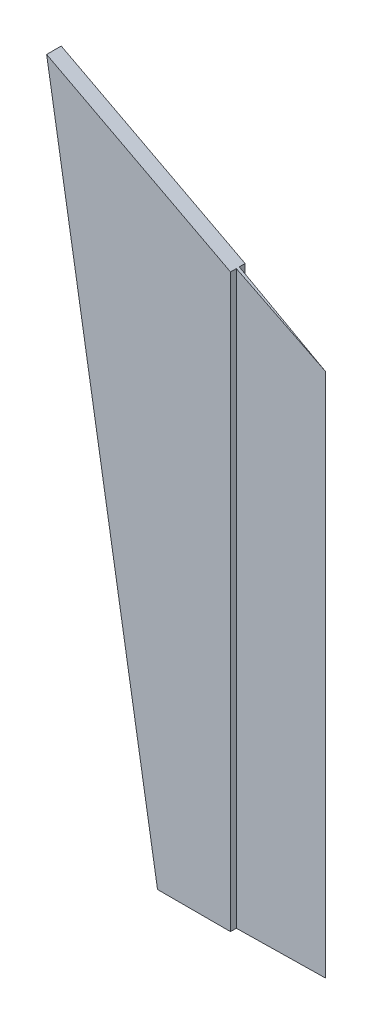
ISO-10303-21;
HEADER;
FILE_DESCRIPTION(('STEP AP214'),'2;1');
FILE_NAME('part.step','',(''),(''),'','','');
FILE_SCHEMA(('AUTOMOTIVE_DESIGN { 1 0 10303 214 1 1 1 1 }'));
ENDSEC;
DATA;
#1=APPLICATION_CONTEXT('core data for automotive mechanical design processes');
#2=APPLICATION_PROTOCOL_DEFINITION('international standard','automotive_design',2000,#1);
#3=PRODUCT_CONTEXT('',#1,'mechanical');
#4=PRODUCT('Part','Part','',(#3));
#5=PRODUCT_RELATED_PRODUCT_CATEGORY('part','',(#4));
#6=PRODUCT_DEFINITION_FORMATION('','',#4);
#7=PRODUCT_DEFINITION_CONTEXT('part definition',#1,'design');
#8=PRODUCT_DEFINITION('design','',#6,#7);
#9=PRODUCT_DEFINITION_SHAPE('','',#8);
#10=(LENGTH_UNIT() NAMED_UNIT(*) SI_UNIT(.MILLI.,.METRE.));
#11=(NAMED_UNIT(*) PLANE_ANGLE_UNIT() SI_UNIT($,.RADIAN.));
#12=(NAMED_UNIT(*) SI_UNIT($,.STERADIAN.) SOLID_ANGLE_UNIT());
#13=UNCERTAINTY_MEASURE_WITH_UNIT(LENGTH_MEASURE(1.E-05),#10,'distance_accuracy_value','');
#14=(GEOMETRIC_REPRESENTATION_CONTEXT(3) GLOBAL_UNCERTAINTY_ASSIGNED_CONTEXT((#13)) GLOBAL_UNIT_ASSIGNED_CONTEXT((#10,
#11,#12)) REPRESENTATION_CONTEXT('',''));
#15=CARTESIAN_POINT('',(0.,0.,0.));
#16=DIRECTION('',(0.,0.,1.));
#17=DIRECTION('',(1.,0.,0.));
#18=AXIS2_PLACEMENT_3D('',#15,#16,#17);
#19=CARTESIAN_POINT('',(47.7409156233783,-114.381441925107,5.));
#20=DIRECTION('',(0.,1.,0.));
#21=DIRECTION('',(-1.,0.,0.));
#22=AXIS2_PLACEMENT_3D('',#19,#20,#21);
#23=PLANE('',#22);
#24=DIRECTION('',(0.999860916611549,0.,-0.0166777526277525));
#25=VECTOR('',#24,1.);
#26=CARTESIAN_POINT('',(17.7409156233782,-114.381441925107,3.00040217646287));
#27=LINE('',#26,#25);
#28=CARTESIAN_POINT('',(17.7409156233782,-114.381441925107,3.00040217646287));
#29=VERTEX_POINT('',#28);
#30=CARTESIAN_POINT('',(47.7409156233783,-114.381441925107,2.5));
#31=VERTEX_POINT('',#30);
#32=EDGE_CURVE('E132',#29,#31,#27,.T.);
#33=ORIENTED_EDGE('',*,*,#32,.F.);
#34=DIRECTION('',(0.,0.,-1.));
#35=VECTOR('',#34,1.);
#36=CARTESIAN_POINT('',(17.7409156233782,-114.381441925107,3.00040217646287));
#37=LINE('',#36,#35);
#38=CARTESIAN_POINT('',(17.7409156233782,-114.381441925107,5.));
#39=VERTEX_POINT('',#38);
#40=EDGE_CURVE('E134',#39,#29,#37,.T.);
#41=ORIENTED_EDGE('',*,*,#40,.F.);
#42=DIRECTION('',(1.,0.,0.));
#43=VECTOR('',#42,1.);
#44=CARTESIAN_POINT('',(47.7409156233783,-114.381441925107,5.));
#45=LINE('',#44,#43);
#46=CARTESIAN_POINT('',(-7.25908437662172,-114.381441925107,5.));
#47=VERTEX_POINT('',#46);
#48=EDGE_CURVE('E81',#47,#39,#45,.T.);
#49=ORIENTED_EDGE('',*,*,#48,.F.);
#50=DIRECTION('',(0.,0.,-1.));
#51=VECTOR('',#50,1.);
#52=CARTESIAN_POINT('',(-7.25908437662172,-114.381441925107,5.));
#53=LINE('',#52,#51);
#54=CARTESIAN_POINT('',(-7.25908437662172,-114.381441925107,0.));
#55=VERTEX_POINT('',#54);
#56=EDGE_CURVE('E74',#47,#55,#53,.T.);
#57=ORIENTED_EDGE('',*,*,#56,.T.);
#58=DIRECTION('',(1.,0.,0.));
#59=VECTOR('',#58,1.);
#60=CARTESIAN_POINT('',(47.7409156233783,-114.381441925107,0.));
#61=LINE('',#60,#59);
#62=CARTESIAN_POINT('',(17.7409156233782,-114.381441925107,0.));
#63=VERTEX_POINT('',#62);
#64=EDGE_CURVE('E87',#55,#63,#61,.T.);
#65=ORIENTED_EDGE('',*,*,#64,.T.);
#66=DIRECTION('',(0.,0.,-1.));
#67=VECTOR('',#66,1.);
#68=CARTESIAN_POINT('',(17.7409156233782,-114.381441925107,0.));
#69=LINE('',#68,#67);
#70=CARTESIAN_POINT('',(17.7409156233782,-114.381441925107,1.99959782353713));
#71=VERTEX_POINT('',#70);
#72=EDGE_CURVE('E49',#71,#63,#69,.T.);
#73=ORIENTED_EDGE('',*,*,#72,.F.);
#74=DIRECTION('',(-0.999860916611549,0.,-0.0166777526277525));
#75=VECTOR('',#74,1.);
#76=CARTESIAN_POINT('',(17.7409156233782,-114.381441925107,1.99959782353713));
#77=LINE('',#76,#75);
#78=EDGE_CURVE('E158',#31,#71,#77,.T.);
#79=ORIENTED_EDGE('',*,*,#78,.F.);
#80=EDGE_LOOP('',(#33,#41,#49,#57,#65,#73,#79));
#81=FACE_BOUND('',#80,.T.);
#82=ADVANCED_FACE('F35',(#81),#23,.F.);
#83=CARTESIAN_POINT('',(-45.2493051453164,114.381441925107,5.));
#84=DIRECTION('',(-0.464408417621082,-0.885621150178045,0.));
#85=DIRECTION('',(0.885621150178045,-0.464408417621082,0.));
#86=AXIS2_PLACEMENT_3D('',#83,#84,#85);
#87=PLANE('',#86);
#88=DIRECTION('',(-0.885621150178045,0.464408417621082,0.));
#89=VECTOR('',#88,1.);
#90=CARTESIAN_POINT('',(-45.2493051453164,114.381441925107,5.));
#91=LINE('',#90,#89);
#92=CARTESIAN_POINT('',(17.7409156233782,81.3501748343072,5.));
#93=VERTEX_POINT('',#92);
#94=CARTESIAN_POINT('',(-45.2493051453164,114.381441925107,5.));
#95=VERTEX_POINT('',#94);
#96=EDGE_CURVE('E143',#93,#95,#91,.T.);
#97=ORIENTED_EDGE('',*,*,#96,.F.);
#98=DIRECTION('',(0.,0.,-1.));
#99=VECTOR('',#98,1.);
#100=CARTESIAN_POINT('',(17.7409156233781,81.3501748343073,5.));
#101=LINE('',#100,#99);
#102=CARTESIAN_POINT('',(17.7409156233782,81.3501748343073,3.00040217646287));
#103=VERTEX_POINT('',#102);
#104=EDGE_CURVE('E92',#93,#103,#101,.T.);
#105=ORIENTED_EDGE('',*,*,#104,.T.);
#106=DIRECTION('',(0.885524536471786,-0.464357754627729,-0.0147706135120584));
#107=VECTOR('',#106,1.);
#108=CARTESIAN_POINT('',(-45.2617167253829,114.38795039914,4.05129065480319));
#109=LINE('',#108,#107);
#110=CARTESIAN_POINT('',(47.7409156233782,65.6185580748932,2.5));
#111=VERTEX_POINT('',#110);
#112=EDGE_CURVE('E11',#103,#111,#109,.T.);
#113=ORIENTED_EDGE('',*,*,#112,.T.);
#114=DIRECTION('',(-0.885524536471786,0.464357754627729,-0.0147706135120584));
#115=VECTOR('',#114,1.);
#116=CARTESIAN_POINT('',(-45.1963180219646,114.353656154515,0.949800200314423));
#117=LINE('',#116,#115);
#118=CARTESIAN_POINT('',(17.7409156233782,81.3501748343073,1.99959782353713));
#119=VERTEX_POINT('',#118);
#120=EDGE_CURVE('E42',#111,#119,#117,.T.);
#121=ORIENTED_EDGE('',*,*,#120,.T.);
#122=DIRECTION('',(0.,0.,-1.));
#123=VECTOR('',#122,1.);
#124=CARTESIAN_POINT('',(17.7409156233781,81.3501748343073,5.));
#125=LINE('',#124,#123);
#126=CARTESIAN_POINT('',(17.7409156233782,81.3501748343073,0.));
#127=VERTEX_POINT('',#126);
#128=EDGE_CURVE('E96',#119,#127,#125,.T.);
#129=ORIENTED_EDGE('',*,*,#128,.T.);
#130=DIRECTION('',(-0.885621150178045,0.464408417621082,0.));
#131=VECTOR('',#130,1.);
#132=CARTESIAN_POINT('',(-45.2493051453164,114.381441925107,0.));
#133=LINE('',#132,#131);
#134=CARTESIAN_POINT('',(-45.2493051453164,114.381441925107,0.));
#135=VERTEX_POINT('',#134);
#136=EDGE_CURVE('E82',#127,#135,#133,.T.);
#137=ORIENTED_EDGE('',*,*,#136,.T.);
#138=DIRECTION('',(0.,0.,-1.));
#139=VECTOR('',#138,1.);
#140=CARTESIAN_POINT('',(-45.2493051453164,114.381441925107,5.));
#141=LINE('',#140,#139);
#142=EDGE_CURVE('E77',#95,#135,#141,.T.);
#143=ORIENTED_EDGE('',*,*,#142,.F.);
#144=EDGE_LOOP('',(#97,#105,#113,#121,#129,#137,#143));
#145=FACE_BOUND('',#144,.T.);
#146=ADVANCED_FACE('F111',(#145),#87,.F.);
#147=CARTESIAN_POINT('',(-7.25908437662172,-114.381441925107,5.));
#148=DIRECTION('',(0.986489507691699,0.163824452430611,0.));
#149=DIRECTION('',(-0.163824452430611,0.986489507691699,0.));
#150=AXIS2_PLACEMENT_3D('',#147,#148,#149);
#151=PLANE('',#150);
#152=DIRECTION('',(0.163824452430611,-0.986489507691699,0.));
#153=VECTOR('',#152,1.);
#154=CARTESIAN_POINT('',(-7.25908437662172,-114.381441925107,0.));
#155=LINE('',#154,#153);
#156=EDGE_CURVE('E71',#135,#55,#155,.T.);
#157=ORIENTED_EDGE('',*,*,#156,.T.);
#158=ORIENTED_EDGE('',*,*,#56,.F.);
#159=DIRECTION('',(0.163824452430611,-0.986489507691699,0.));
#160=VECTOR('',#159,1.);
#161=CARTESIAN_POINT('',(-7.25908437662172,-114.381441925107,5.));
#162=LINE('',#161,#160);
#163=EDGE_CURVE('E58',#95,#47,#162,.T.);
#164=ORIENTED_EDGE('',*,*,#163,.F.);
#165=ORIENTED_EDGE('',*,*,#142,.T.);
#166=EDGE_LOOP('',(#157,#158,#164,#165));
#167=FACE_BOUND('',#166,.T.);
#168=ADVANCED_FACE('F73',(#167),#151,.F.);
#169=CARTESIAN_POINT('',(0.,0.,5.));
#170=DIRECTION('',(0.,0.,1.));
#171=DIRECTION('',(1.,0.,0.));
#172=AXIS2_PLACEMENT_3D('',#169,#170,#171);
#173=PLANE('',#172);
#174=DIRECTION('',(0.,-1.,0.));
#175=VECTOR('',#174,1.);
#176=CARTESIAN_POINT('',(17.7409156233782,0.,5.));
#177=LINE('',#176,#175);
#178=EDGE_CURVE('E103',#93,#39,#177,.T.);
#179=ORIENTED_EDGE('',*,*,#178,.F.);
#180=ORIENTED_EDGE('',*,*,#96,.T.);
#181=ORIENTED_EDGE('',*,*,#163,.T.);
#182=ORIENTED_EDGE('',*,*,#48,.T.);
#183=EDGE_LOOP('',(#179,#180,#181,#182));
#184=FACE_BOUND('',#183,.T.);
#185=ADVANCED_FACE('F145',(#184),#173,.T.);
#186=CARTESIAN_POINT('',(0.,0.,0.));
#187=DIRECTION('',(0.,0.,1.));
#188=DIRECTION('',(1.,0.,0.));
#189=AXIS2_PLACEMENT_3D('',#186,#187,#188);
#190=PLANE('',#189);
#191=ORIENTED_EDGE('',*,*,#136,.F.);
#192=DIRECTION('',(0.,-1.,0.));
#193=VECTOR('',#192,1.);
#194=CARTESIAN_POINT('',(17.7409156233782,0.,0.));
#195=LINE('',#194,#193);
#196=EDGE_CURVE('E91',#127,#63,#195,.T.);
#197=ORIENTED_EDGE('',*,*,#196,.T.);
#198=ORIENTED_EDGE('',*,*,#64,.F.);
#199=ORIENTED_EDGE('',*,*,#156,.F.);
#200=EDGE_LOOP('',(#191,#197,#198,#199));
#201=FACE_BOUND('',#200,.T.);
#202=ADVANCED_FACE('F90',(#201),#190,.F.);
#203=CARTESIAN_POINT('',(17.7409156233782,85.6185580748932,3.00040217646287));
#204=DIRECTION('',(-0.0166777526277525,0.,-0.999860916611549));
#205=DIRECTION('',(-0.999860916611549,0.,0.0166777526277525));
#206=AXIS2_PLACEMENT_3D('',#203,#204,#205);
#207=PLANE('',#206);
#208=DIRECTION('',(0.,-1.,0.));
#209=VECTOR('',#208,1.);
#210=CARTESIAN_POINT('',(17.7409156233782,85.6185580748932,3.00040217646287));
#211=LINE('',#210,#209);
#212=EDGE_CURVE('E136',#103,#29,#211,.T.);
#213=ORIENTED_EDGE('',*,*,#212,.T.);
#214=ORIENTED_EDGE('',*,*,#32,.T.);
#215=DIRECTION('',(0.,-1.,0.));
#216=VECTOR('',#215,1.);
#217=CARTESIAN_POINT('',(47.7409156233782,85.6185580748932,2.5));
#218=LINE('',#217,#216);
#219=EDGE_CURVE('E124',#111,#31,#218,.T.);
#220=ORIENTED_EDGE('',*,*,#219,.F.);
#221=ORIENTED_EDGE('',*,*,#112,.F.);
#222=EDGE_LOOP('',(#213,#214,#220,#221));
#223=FACE_BOUND('',#222,.T.);
#224=ADVANCED_FACE('F130',(#223),#207,.F.);
#225=CARTESIAN_POINT('',(17.7409156233782,85.6185580748932,1.99959782353713));
#226=DIRECTION('',(-0.0166777526277525,0.,0.999860916611549));
#227=DIRECTION('',(0.999860916611549,0.,0.0166777526277525));
#228=AXIS2_PLACEMENT_3D('',#225,#226,#227);
#229=PLANE('',#228);
#230=ORIENTED_EDGE('',*,*,#219,.T.);
#231=ORIENTED_EDGE('',*,*,#78,.T.);
#232=DIRECTION('',(0.,-1.,0.));
#233=VECTOR('',#232,1.);
#234=CARTESIAN_POINT('',(17.7409156233782,85.6185580748932,1.99959782353713));
#235=LINE('',#234,#233);
#236=EDGE_CURVE('E126',#119,#71,#235,.T.);
#237=ORIENTED_EDGE('',*,*,#236,.F.);
#238=ORIENTED_EDGE('',*,*,#120,.F.);
#239=EDGE_LOOP('',(#230,#231,#237,#238));
#240=FACE_BOUND('',#239,.T.);
#241=ADVANCED_FACE('F121',(#240),#229,.F.);
#242=CARTESIAN_POINT('',(17.7409156233782,85.6185580748932,3.00040217646287));
#243=DIRECTION('',(-1.,0.,0.));
#244=DIRECTION('',(0.,-1.,0.));
#245=AXIS2_PLACEMENT_3D('',#242,#243,#244);
#246=PLANE('',#245);
#247=ORIENTED_EDGE('',*,*,#178,.T.);
#248=ORIENTED_EDGE('',*,*,#40,.T.);
#249=ORIENTED_EDGE('',*,*,#212,.F.);
#250=ORIENTED_EDGE('',*,*,#104,.F.);
#251=EDGE_LOOP('',(#247,#248,#249,#250));
#252=FACE_BOUND('',#251,.T.);
#253=ADVANCED_FACE('F163',(#252),#246,.F.);
#254=CARTESIAN_POINT('',(17.7409156233782,85.6185580748932,0.));
#255=DIRECTION('',(-1.,0.,0.));
#256=DIRECTION('',(0.,-1.,0.));
#257=AXIS2_PLACEMENT_3D('',#254,#255,#256);
#258=PLANE('',#257);
#259=ORIENTED_EDGE('',*,*,#236,.T.);
#260=ORIENTED_EDGE('',*,*,#72,.T.);
#261=ORIENTED_EDGE('',*,*,#196,.F.);
#262=ORIENTED_EDGE('',*,*,#128,.F.);
#263=EDGE_LOOP('',(#259,#260,#261,#262));
#264=FACE_BOUND('',#263,.T.);
#265=ADVANCED_FACE('F157',(#264),#258,.F.);
#266=CLOSED_SHELL('',(#82,#146,#168,#185,#202,#224,#241,#253,#265));
#267=MANIFOLD_SOLID_BREP('B2',#266);
#268=ADVANCED_BREP_SHAPE_REPRESENTATION('',(#18,#267),#14);
#269=SHAPE_DEFINITION_REPRESENTATION(#9,#268);
ENDSEC;
END-ISO-10303-21;
